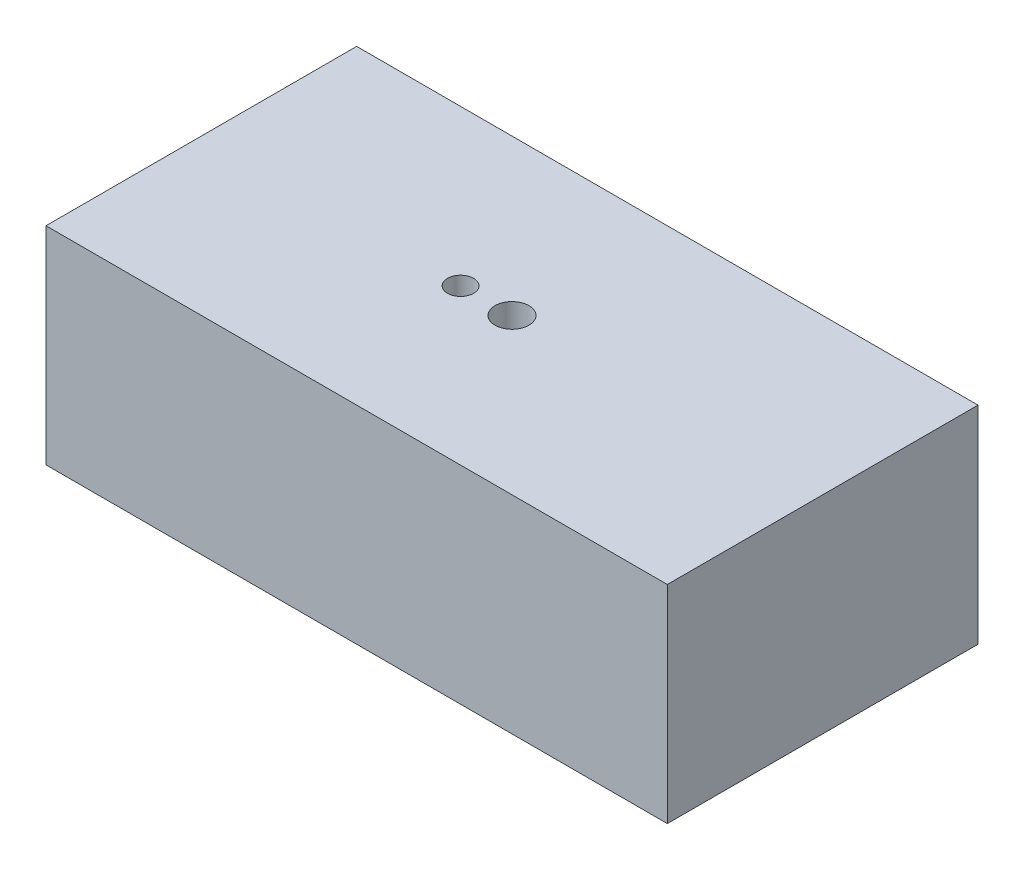
ISO-10303-21;
HEADER;
FILE_DESCRIPTION(('STEP AP214'),'2;1');
FILE_NAME('part.step','',(''),(''),'','','');
FILE_SCHEMA(('AUTOMOTIVE_DESIGN { 1 0 10303 214 1 1 1 1 }'));
ENDSEC;
DATA;
#1=APPLICATION_CONTEXT('core data for automotive mechanical design processes');
#2=APPLICATION_PROTOCOL_DEFINITION('international standard','automotive_design',2000,#1);
#3=PRODUCT_CONTEXT('',#1,'mechanical');
#4=PRODUCT('Part','Part','',(#3));
#5=PRODUCT_RELATED_PRODUCT_CATEGORY('part','',(#4));
#6=PRODUCT_DEFINITION_FORMATION('','',#4);
#7=PRODUCT_DEFINITION_CONTEXT('part definition',#1,'design');
#8=PRODUCT_DEFINITION('design','',#6,#7);
#9=PRODUCT_DEFINITION_SHAPE('','',#8);
#10=(LENGTH_UNIT() NAMED_UNIT(*) SI_UNIT(.MILLI.,.METRE.));
#11=(NAMED_UNIT(*) PLANE_ANGLE_UNIT() SI_UNIT($,.RADIAN.));
#12=(NAMED_UNIT(*) SI_UNIT($,.STERADIAN.) SOLID_ANGLE_UNIT());
#13=UNCERTAINTY_MEASURE_WITH_UNIT(LENGTH_MEASURE(1.E-05),#10,'distance_accuracy_value','');
#14=(GEOMETRIC_REPRESENTATION_CONTEXT(3) GLOBAL_UNCERTAINTY_ASSIGNED_CONTEXT((#13)) GLOBAL_UNIT_ASSIGNED_CONTEXT((#10,
#11,#12)) REPRESENTATION_CONTEXT('',''));
#15=CARTESIAN_POINT('',(0.,0.,0.));
#16=DIRECTION('',(0.,0.,1.));
#17=DIRECTION('',(1.,0.,0.));
#18=AXIS2_PLACEMENT_3D('',#15,#16,#17);
#19=CARTESIAN_POINT('',(0.,10.,0.));
#20=DIRECTION('',(0.,-1.,0.));
#21=DIRECTION('',(0.,0.,-1.));
#22=AXIS2_PLACEMENT_3D('',#19,#20,#21);
#23=PLANE('',#22);
#24=CARTESIAN_POINT('',(0.,10.,0.));
#25=DIRECTION('',(0.,1.,0.));
#26=DIRECTION('',(0.,0.,1.));
#27=AXIS2_PLACEMENT_3D('',#24,#25,#26);
#28=CIRCLE('',#27,0.82);
#29=CARTESIAN_POINT('',(0.,10.,0.82));
#30=VERTEX_POINT('',#29);
#31=EDGE_CURVE('E100',#30,#30,#28,.T.);
#32=ORIENTED_EDGE('',*,*,#31,.F.);
#33=EDGE_LOOP('',(#32));
#34=FACE_BOUND('',#33,.T.);
#35=DIRECTION('',(0.,0.,1.));
#36=VECTOR('',#35,1.);
#37=CARTESIAN_POINT('',(-15.,10.,7.5));
#38=LINE('',#37,#36);
#39=CARTESIAN_POINT('',(-15.,10.,-7.5));
#40=VERTEX_POINT('',#39);
#41=CARTESIAN_POINT('',(-15.,10.,7.5));
#42=VERTEX_POINT('',#41);
#43=EDGE_CURVE('E85',#40,#42,#38,.T.);
#44=ORIENTED_EDGE('',*,*,#43,.T.);
#45=DIRECTION('',(1.,0.,0.));
#46=VECTOR('',#45,1.);
#47=CARTESIAN_POINT('',(-15.,10.,7.5));
#48=LINE('',#47,#46);
#49=CARTESIAN_POINT('',(15.,10.,7.5));
#50=VERTEX_POINT('',#49);
#51=EDGE_CURVE('E80',#42,#50,#48,.T.);
#52=ORIENTED_EDGE('',*,*,#51,.T.);
#53=DIRECTION('',(0.,0.,-1.));
#54=VECTOR('',#53,1.);
#55=CARTESIAN_POINT('',(15.,10.,7.5));
#56=LINE('',#55,#54);
#57=CARTESIAN_POINT('',(15.,10.,-7.5));
#58=VERTEX_POINT('',#57);
#59=EDGE_CURVE('E83',#50,#58,#56,.T.);
#60=ORIENTED_EDGE('',*,*,#59,.T.);
#61=DIRECTION('',(-1.,0.,0.));
#62=VECTOR('',#61,1.);
#63=CARTESIAN_POINT('',(-15.,10.,-7.5));
#64=LINE('',#63,#62);
#65=EDGE_CURVE('E50',#58,#40,#64,.T.);
#66=ORIENTED_EDGE('',*,*,#65,.T.);
#67=EDGE_LOOP('',(#44,#52,#60,#66));
#68=FACE_BOUND('',#67,.T.);
#69=CARTESIAN_POINT('',(-2.47999561938545,10.,0.00466131193597599));
#70=DIRECTION('',(0.,1.,0.));
#71=DIRECTION('',(0.,0.,1.));
#72=AXIS2_PLACEMENT_3D('',#69,#70,#71);
#73=CIRCLE('',#72,0.630000000000001);
#74=CARTESIAN_POINT('',(-2.47999561938545,10.,0.634661311935977));
#75=VERTEX_POINT('',#74);
#76=EDGE_CURVE('E115',#75,#75,#73,.T.);
#77=ORIENTED_EDGE('',*,*,#76,.F.);
#78=EDGE_LOOP('',(#77));
#79=FACE_BOUND('',#78,.T.);
#80=ADVANCED_FACE('F33',(#34,#68,#79),#23,.F.);
#81=CARTESIAN_POINT('',(0.,0.,0.));
#82=DIRECTION('',(0.,-1.,0.));
#83=DIRECTION('',(0.,0.,-1.));
#84=AXIS2_PLACEMENT_3D('',#81,#82,#83);
#85=PLANE('',#84);
#86=CARTESIAN_POINT('',(0.,0.,0.));
#87=DIRECTION('',(0.,1.,0.));
#88=DIRECTION('',(0.,0.,1.));
#89=AXIS2_PLACEMENT_3D('',#86,#87,#88);
#90=CIRCLE('',#89,0.82);
#91=CARTESIAN_POINT('',(0.,0.,0.82));
#92=VERTEX_POINT('',#91);
#93=EDGE_CURVE('E112',#92,#92,#90,.T.);
#94=ORIENTED_EDGE('',*,*,#93,.T.);
#95=EDGE_LOOP('',(#94));
#96=FACE_BOUND('',#95,.T.);
#97=DIRECTION('',(0.,0.,1.));
#98=VECTOR('',#97,1.);
#99=CARTESIAN_POINT('',(-15.,0.,7.5));
#100=LINE('',#99,#98);
#101=CARTESIAN_POINT('',(-15.,0.,-7.5));
#102=VERTEX_POINT('',#101);
#103=CARTESIAN_POINT('',(-15.,0.,7.5));
#104=VERTEX_POINT('',#103);
#105=EDGE_CURVE('E97',#102,#104,#100,.T.);
#106=ORIENTED_EDGE('',*,*,#105,.F.);
#107=DIRECTION('',(-1.,0.,0.));
#108=VECTOR('',#107,1.);
#109=CARTESIAN_POINT('',(-15.,0.,-7.5));
#110=LINE('',#109,#108);
#111=CARTESIAN_POINT('',(15.,0.,-7.5));
#112=VERTEX_POINT('',#111);
#113=EDGE_CURVE('E73',#112,#102,#110,.T.);
#114=ORIENTED_EDGE('',*,*,#113,.F.);
#115=DIRECTION('',(0.,0.,-1.));
#116=VECTOR('',#115,1.);
#117=CARTESIAN_POINT('',(15.,0.,7.5));
#118=LINE('',#117,#116);
#119=CARTESIAN_POINT('',(15.,0.,7.5));
#120=VERTEX_POINT('',#119);
#121=EDGE_CURVE('E67',#120,#112,#118,.T.);
#122=ORIENTED_EDGE('',*,*,#121,.F.);
#123=DIRECTION('',(1.,0.,0.));
#124=VECTOR('',#123,1.);
#125=CARTESIAN_POINT('',(-15.,0.,7.5));
#126=LINE('',#125,#124);
#127=EDGE_CURVE('E89',#104,#120,#126,.T.);
#128=ORIENTED_EDGE('',*,*,#127,.F.);
#129=EDGE_LOOP('',(#106,#114,#122,#128));
#130=FACE_BOUND('',#129,.T.);
#131=CARTESIAN_POINT('',(-2.47999561938545,0.,0.00466131193597599));
#132=DIRECTION('',(0.,1.,0.));
#133=DIRECTION('',(0.,0.,1.));
#134=AXIS2_PLACEMENT_3D('',#131,#132,#133);
#135=CIRCLE('',#134,0.630000000000001);
#136=CARTESIAN_POINT('',(-2.47999561938545,0.,0.634661311935977));
#137=VERTEX_POINT('',#136);
#138=EDGE_CURVE('E118',#137,#137,#135,.T.);
#139=ORIENTED_EDGE('',*,*,#138,.T.);
#140=EDGE_LOOP('',(#139));
#141=FACE_BOUND('',#140,.T.);
#142=ADVANCED_FACE('F108',(#96,#130,#141),#85,.T.);
#143=CARTESIAN_POINT('',(-15.,10.,7.5));
#144=DIRECTION('',(1.,0.,0.));
#145=DIRECTION('',(0.,0.,-1.));
#146=AXIS2_PLACEMENT_3D('',#143,#144,#145);
#147=PLANE('',#146);
#148=ORIENTED_EDGE('',*,*,#105,.T.);
#149=DIRECTION('',(0.,-1.,0.));
#150=VECTOR('',#149,1.);
#151=CARTESIAN_POINT('',(-15.,10.,7.5));
#152=LINE('',#151,#150);
#153=EDGE_CURVE('E11',#42,#104,#152,.T.);
#154=ORIENTED_EDGE('',*,*,#153,.F.);
#155=ORIENTED_EDGE('',*,*,#43,.F.);
#156=DIRECTION('',(0.,-1.,0.));
#157=VECTOR('',#156,1.);
#158=CARTESIAN_POINT('',(-15.,10.,-7.5));
#159=LINE('',#158,#157);
#160=EDGE_CURVE('E93',#40,#102,#159,.T.);
#161=ORIENTED_EDGE('',*,*,#160,.T.);
#162=EDGE_LOOP('',(#148,#154,#155,#161));
#163=FACE_BOUND('',#162,.T.);
#164=ADVANCED_FACE('F35',(#163),#147,.F.);
#165=CARTESIAN_POINT('',(-15.,10.,7.5));
#166=DIRECTION('',(0.,0.,-1.));
#167=DIRECTION('',(-1.,0.,0.));
#168=AXIS2_PLACEMENT_3D('',#165,#166,#167);
#169=PLANE('',#168);
#170=ORIENTED_EDGE('',*,*,#127,.T.);
#171=DIRECTION('',(0.,-1.,0.));
#172=VECTOR('',#171,1.);
#173=CARTESIAN_POINT('',(15.,10.,7.5));
#174=LINE('',#173,#172);
#175=EDGE_CURVE('E42',#50,#120,#174,.T.);
#176=ORIENTED_EDGE('',*,*,#175,.F.);
#177=ORIENTED_EDGE('',*,*,#51,.F.);
#178=ORIENTED_EDGE('',*,*,#153,.T.);
#179=EDGE_LOOP('',(#170,#176,#177,#178));
#180=FACE_BOUND('',#179,.T.);
#181=ADVANCED_FACE('F88',(#180),#169,.F.);
#182=CARTESIAN_POINT('',(15.,10.,7.5));
#183=DIRECTION('',(-1.,0.,0.));
#184=DIRECTION('',(0.,0.,1.));
#185=AXIS2_PLACEMENT_3D('',#182,#183,#184);
#186=PLANE('',#185);
#187=ORIENTED_EDGE('',*,*,#121,.T.);
#188=DIRECTION('',(0.,-1.,0.));
#189=VECTOR('',#188,1.);
#190=CARTESIAN_POINT('',(15.,10.,-7.5));
#191=LINE('',#190,#189);
#192=EDGE_CURVE('E90',#58,#112,#191,.T.);
#193=ORIENTED_EDGE('',*,*,#192,.F.);
#194=ORIENTED_EDGE('',*,*,#59,.F.);
#195=ORIENTED_EDGE('',*,*,#175,.T.);
#196=EDGE_LOOP('',(#187,#193,#194,#195));
#197=FACE_BOUND('',#196,.T.);
#198=ADVANCED_FACE('F91',(#197),#186,.F.);
#199=CARTESIAN_POINT('',(-15.,10.,-7.5));
#200=DIRECTION('',(0.,0.,1.));
#201=DIRECTION('',(1.,0.,0.));
#202=AXIS2_PLACEMENT_3D('',#199,#200,#201);
#203=PLANE('',#202);
#204=ORIENTED_EDGE('',*,*,#113,.T.);
#205=ORIENTED_EDGE('',*,*,#160,.F.);
#206=ORIENTED_EDGE('',*,*,#65,.F.);
#207=ORIENTED_EDGE('',*,*,#192,.T.);
#208=EDGE_LOOP('',(#204,#205,#206,#207));
#209=FACE_BOUND('',#208,.T.);
#210=ADVANCED_FACE('F105',(#209),#203,.F.);
#211=CARTESIAN_POINT('',(0.,10.,0.));
#212=DIRECTION('',(0.,-1.,0.));
#213=DIRECTION('',(0.,0.,-1.));
#214=AXIS2_PLACEMENT_3D('',#211,#212,#213);
#215=CYLINDRICAL_SURFACE('',#214,0.82);
#216=ORIENTED_EDGE('',*,*,#31,.T.);
#217=EDGE_LOOP('',(#216));
#218=FACE_BOUND('',#217,.T.);
#219=ORIENTED_EDGE('',*,*,#93,.F.);
#220=EDGE_LOOP('',(#219));
#221=FACE_BOUND('',#220,.T.);
#222=ADVANCED_FACE('F136',(#218,#221),#215,.F.);
#223=CARTESIAN_POINT('',(-2.47999561938545,10.,0.00466131193597599));
#224=DIRECTION('',(0.,-1.,0.));
#225=DIRECTION('',(0.,0.,-1.));
#226=AXIS2_PLACEMENT_3D('',#223,#224,#225);
#227=CYLINDRICAL_SURFACE('',#226,0.630000000000001);
#228=ORIENTED_EDGE('',*,*,#76,.T.);
#229=EDGE_LOOP('',(#228));
#230=FACE_BOUND('',#229,.T.);
#231=ORIENTED_EDGE('',*,*,#138,.F.);
#232=EDGE_LOOP('',(#231));
#233=FACE_BOUND('',#232,.T.);
#234=ADVANCED_FACE('F124',(#230,#233),#227,.F.);
#235=CLOSED_SHELL('',(#80,#142,#164,#181,#198,#210,#222,#234));
#236=MANIFOLD_SOLID_BREP('B2',#235);
#237=ADVANCED_BREP_SHAPE_REPRESENTATION('',(#18,#236),#14);
#238=SHAPE_DEFINITION_REPRESENTATION(#9,#237);
ENDSEC;
END-ISO-10303-21;
